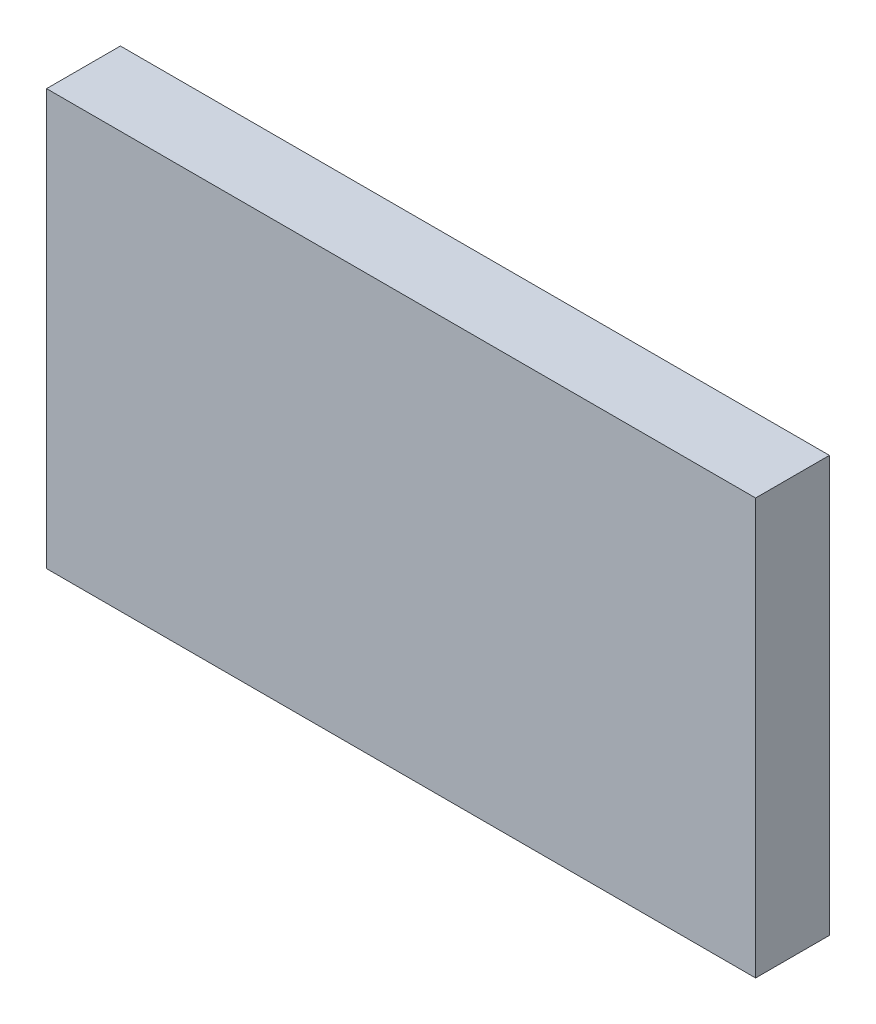
ISO-10303-21;
HEADER;
FILE_DESCRIPTION(('STEP AP214'),'2;1');
FILE_NAME('part.step','',(''),(''),'','','');
FILE_SCHEMA(('AUTOMOTIVE_DESIGN { 1 0 10303 214 1 1 1 1 }'));
ENDSEC;
DATA;
#1=APPLICATION_CONTEXT('core data for automotive mechanical design processes');
#2=APPLICATION_PROTOCOL_DEFINITION('international standard','automotive_design',2000,#1);
#3=PRODUCT_CONTEXT('',#1,'mechanical');
#4=PRODUCT('Part','Part','',(#3));
#5=PRODUCT_RELATED_PRODUCT_CATEGORY('part','',(#4));
#6=PRODUCT_DEFINITION_FORMATION('','',#4);
#7=PRODUCT_DEFINITION_CONTEXT('part definition',#1,'design');
#8=PRODUCT_DEFINITION('design','',#6,#7);
#9=PRODUCT_DEFINITION_SHAPE('','',#8);
#10=(LENGTH_UNIT() NAMED_UNIT(*) SI_UNIT(.MILLI.,.METRE.));
#11=(NAMED_UNIT(*) PLANE_ANGLE_UNIT() SI_UNIT($,.RADIAN.));
#12=(NAMED_UNIT(*) SI_UNIT($,.STERADIAN.) SOLID_ANGLE_UNIT());
#13=UNCERTAINTY_MEASURE_WITH_UNIT(LENGTH_MEASURE(1.E-05),#10,'distance_accuracy_value','');
#14=(GEOMETRIC_REPRESENTATION_CONTEXT(3) GLOBAL_UNCERTAINTY_ASSIGNED_CONTEXT((#13)) GLOBAL_UNIT_ASSIGNED_CONTEXT((#10,
#11,#12)) REPRESENTATION_CONTEXT('',''));
#15=CARTESIAN_POINT('',(0.,0.,0.));
#16=DIRECTION('',(0.,0.,1.));
#17=DIRECTION('',(1.,0.,0.));
#18=AXIS2_PLACEMENT_3D('',#15,#16,#17);
#19=CARTESIAN_POINT('',(-670.512804064781,1870.54813302477,76.));
#20=DIRECTION('',(0.,1.,0.));
#21=DIRECTION('',(0.,0.,1.));
#22=AXIS2_PLACEMENT_3D('',#19,#20,#21);
#23=PLANE('',#22);
#24=DIRECTION('',(1.,0.,0.));
#25=VECTOR('',#24,1.);
#26=CARTESIAN_POINT('',(-670.512804064781,1870.54813302477,0.));
#27=LINE('',#26,#25);
#28=CARTESIAN_POINT('',(-670.512804064781,1870.54813302477,0.));
#29=VERTEX_POINT('',#28);
#30=CARTESIAN_POINT('',(59.4871959352196,1870.54813302477,0.));
#31=VERTEX_POINT('',#30);
#32=EDGE_CURVE('E98',#29,#31,#27,.T.);
#33=ORIENTED_EDGE('',*,*,#32,.F.);
#34=DIRECTION('',(0.,0.,-1.));
#35=VECTOR('',#34,1.);
#36=CARTESIAN_POINT('',(-670.512804064781,1870.54813302477,76.));
#37=LINE('',#36,#35);
#38=CARTESIAN_POINT('',(-670.512804064781,1870.54813302477,76.));
#39=VERTEX_POINT('',#38);
#40=EDGE_CURVE('E11',#39,#29,#37,.T.);
#41=ORIENTED_EDGE('',*,*,#40,.F.);
#42=DIRECTION('',(1.,0.,0.));
#43=VECTOR('',#42,1.);
#44=CARTESIAN_POINT('',(-670.512804064781,1870.54813302477,76.));
#45=LINE('',#44,#43);
#46=CARTESIAN_POINT('',(59.4871959352196,1870.54813302477,76.));
#47=VERTEX_POINT('',#46);
#48=EDGE_CURVE('E93',#39,#47,#45,.T.);
#49=ORIENTED_EDGE('',*,*,#48,.T.);
#50=DIRECTION('',(0.,0.,-1.));
#51=VECTOR('',#50,1.);
#52=CARTESIAN_POINT('',(59.4871959352196,1870.54813302477,76.));
#53=LINE('',#52,#51);
#54=EDGE_CURVE('E36',#47,#31,#53,.T.);
#55=ORIENTED_EDGE('',*,*,#54,.T.);
#56=EDGE_LOOP('',(#33,#41,#49,#55));
#57=FACE_BOUND('',#56,.T.);
#58=ADVANCED_FACE('F33',(#57),#23,.T.);
#59=CARTESIAN_POINT('',(-670.512804064781,1870.54813302477,76.));
#60=DIRECTION('',(1.,0.,0.));
#61=DIRECTION('',(0.,0.,-1.));
#62=AXIS2_PLACEMENT_3D('',#59,#60,#61);
#63=PLANE('',#62);
#64=DIRECTION('',(0.,-1.,0.));
#65=VECTOR('',#64,1.);
#66=CARTESIAN_POINT('',(-670.512804064781,1870.54813302477,0.));
#67=LINE('',#66,#65);
#68=CARTESIAN_POINT('',(-670.512804064781,1442.54813302477,0.));
#69=VERTEX_POINT('',#68);
#70=EDGE_CURVE('E66',#29,#69,#67,.T.);
#71=ORIENTED_EDGE('',*,*,#70,.T.);
#72=DIRECTION('',(0.,0.,-1.));
#73=VECTOR('',#72,1.);
#74=CARTESIAN_POINT('',(-670.512804064781,1442.54813302477,76.));
#75=LINE('',#74,#73);
#76=CARTESIAN_POINT('',(-670.512804064781,1442.54813302477,76.));
#77=VERTEX_POINT('',#76);
#78=EDGE_CURVE('E42',#77,#69,#75,.T.);
#79=ORIENTED_EDGE('',*,*,#78,.F.);
#80=DIRECTION('',(0.,-1.,0.));
#81=VECTOR('',#80,1.);
#82=CARTESIAN_POINT('',(-670.512804064781,1870.54813302477,76.));
#83=LINE('',#82,#81);
#84=EDGE_CURVE('E83',#39,#77,#83,.T.);
#85=ORIENTED_EDGE('',*,*,#84,.F.);
#86=ORIENTED_EDGE('',*,*,#40,.T.);
#87=EDGE_LOOP('',(#71,#79,#85,#86));
#88=FACE_BOUND('',#87,.T.);
#89=ADVANCED_FACE('F108',(#88),#63,.F.);
#90=CARTESIAN_POINT('',(-670.512804064781,1442.54813302477,76.));
#91=DIRECTION('',(0.,1.,0.));
#92=DIRECTION('',(0.,0.,1.));
#93=AXIS2_PLACEMENT_3D('',#90,#91,#92);
#94=PLANE('',#93);
#95=DIRECTION('',(1.,0.,0.));
#96=VECTOR('',#95,1.);
#97=CARTESIAN_POINT('',(-670.512804064781,1442.54813302477,0.));
#98=LINE('',#97,#96);
#99=CARTESIAN_POINT('',(59.4871959352197,1442.54813302477,0.));
#100=VERTEX_POINT('',#99);
#101=EDGE_CURVE('E90',#69,#100,#98,.T.);
#102=ORIENTED_EDGE('',*,*,#101,.T.);
#103=DIRECTION('',(0.,0.,-1.));
#104=VECTOR('',#103,1.);
#105=CARTESIAN_POINT('',(59.4871959352197,1442.54813302477,76.));
#106=LINE('',#105,#104);
#107=CARTESIAN_POINT('',(59.4871959352197,1442.54813302477,76.));
#108=VERTEX_POINT('',#107);
#109=EDGE_CURVE('E87',#108,#100,#106,.T.);
#110=ORIENTED_EDGE('',*,*,#109,.F.);
#111=DIRECTION('',(1.,0.,0.));
#112=VECTOR('',#111,1.);
#113=CARTESIAN_POINT('',(-670.512804064781,1442.54813302477,76.));
#114=LINE('',#113,#112);
#115=EDGE_CURVE('E78',#77,#108,#114,.T.);
#116=ORIENTED_EDGE('',*,*,#115,.F.);
#117=ORIENTED_EDGE('',*,*,#78,.T.);
#118=EDGE_LOOP('',(#102,#110,#116,#117));
#119=FACE_BOUND('',#118,.T.);
#120=ADVANCED_FACE('F88',(#119),#94,.F.);
#121=CARTESIAN_POINT('',(59.4871959352196,1870.54813302477,76.));
#122=DIRECTION('',(1.,0.,0.));
#123=DIRECTION('',(0.,1.,0.));
#124=AXIS2_PLACEMENT_3D('',#121,#122,#123);
#125=PLANE('',#124);
#126=DIRECTION('',(0.,-1.,0.));
#127=VECTOR('',#126,1.);
#128=CARTESIAN_POINT('',(59.4871959352196,1870.54813302477,0.));
#129=LINE('',#128,#127);
#130=EDGE_CURVE('E101',#31,#100,#129,.T.);
#131=ORIENTED_EDGE('',*,*,#130,.F.);
#132=ORIENTED_EDGE('',*,*,#54,.F.);
#133=DIRECTION('',(0.,-1.,0.));
#134=VECTOR('',#133,1.);
#135=CARTESIAN_POINT('',(59.4871959352196,1870.54813302477,76.));
#136=LINE('',#135,#134);
#137=EDGE_CURVE('E82',#47,#108,#136,.T.);
#138=ORIENTED_EDGE('',*,*,#137,.T.);
#139=ORIENTED_EDGE('',*,*,#109,.T.);
#140=EDGE_LOOP('',(#131,#132,#138,#139));
#141=FACE_BOUND('',#140,.T.);
#142=ADVANCED_FACE('F92',(#141),#125,.T.);
#143=CARTESIAN_POINT('',(0.,0.,76.));
#144=DIRECTION('',(0.,0.,-1.));
#145=DIRECTION('',(-1.,0.,0.));
#146=AXIS2_PLACEMENT_3D('',#143,#144,#145);
#147=PLANE('',#146);
#148=ORIENTED_EDGE('',*,*,#48,.F.);
#149=ORIENTED_EDGE('',*,*,#84,.T.);
#150=ORIENTED_EDGE('',*,*,#115,.T.);
#151=ORIENTED_EDGE('',*,*,#137,.F.);
#152=EDGE_LOOP('',(#148,#149,#150,#151));
#153=FACE_BOUND('',#152,.T.);
#154=ADVANCED_FACE('F81',(#153),#147,.F.);
#155=CARTESIAN_POINT('',(0.,0.,0.));
#156=DIRECTION('',(0.,0.,-1.));
#157=DIRECTION('',(-1.,0.,0.));
#158=AXIS2_PLACEMENT_3D('',#155,#156,#157);
#159=PLANE('',#158);
#160=ORIENTED_EDGE('',*,*,#32,.T.);
#161=ORIENTED_EDGE('',*,*,#130,.T.);
#162=ORIENTED_EDGE('',*,*,#101,.F.);
#163=ORIENTED_EDGE('',*,*,#70,.F.);
#164=EDGE_LOOP('',(#160,#161,#162,#163));
#165=FACE_BOUND('',#164,.T.);
#166=ADVANCED_FACE('F106',(#165),#159,.T.);
#167=CLOSED_SHELL('',(#58,#89,#120,#142,#154,#166));
#168=MANIFOLD_SOLID_BREP('B2',#167);
#169=ADVANCED_BREP_SHAPE_REPRESENTATION('',(#18,#168),#14);
#170=SHAPE_DEFINITION_REPRESENTATION(#9,#169);
ENDSEC;
END-ISO-10303-21;
